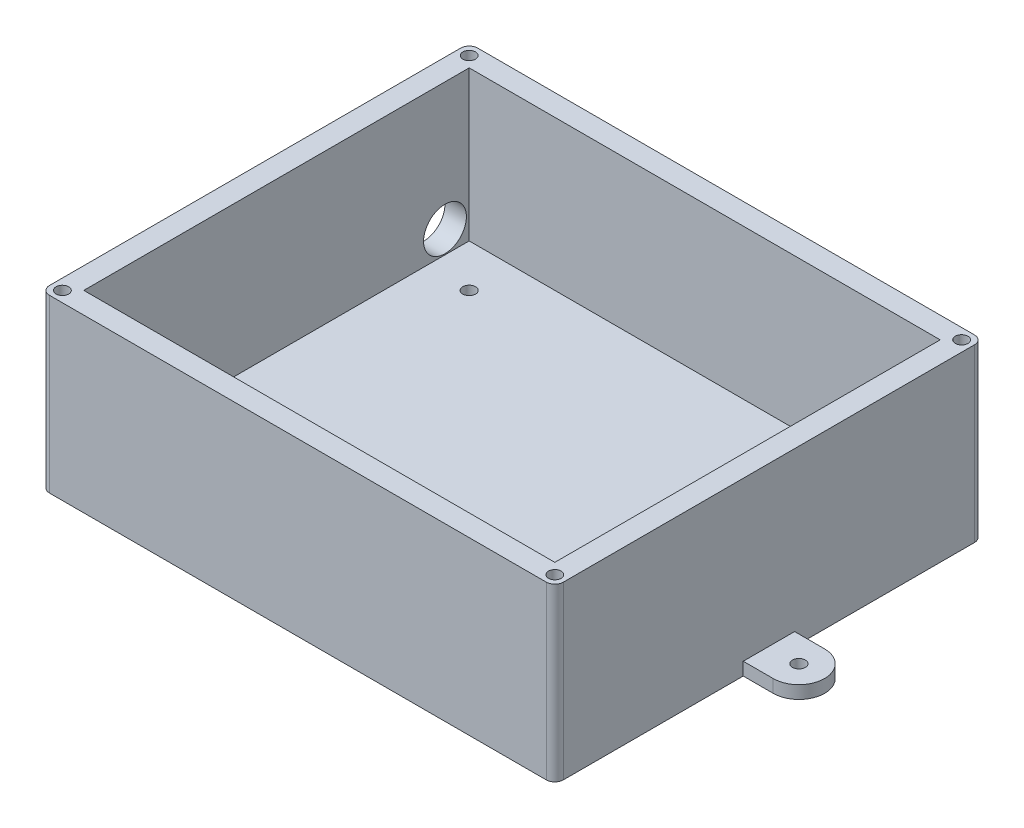
ISO-10303-21;
HEADER;
FILE_DESCRIPTION(('STEP AP214'),'2;1');
FILE_NAME('part.step','',(''),(''),'','','');
FILE_SCHEMA(('AUTOMOTIVE_DESIGN { 1 0 10303 214 1 1 1 1 }'));
ENDSEC;
DATA;
#1=APPLICATION_CONTEXT('core data for automotive mechanical design processes');
#2=APPLICATION_PROTOCOL_DEFINITION('international standard','automotive_design',2000,#1);
#3=PRODUCT_CONTEXT('',#1,'mechanical');
#4=PRODUCT('Part','Part','',(#3));
#5=PRODUCT_RELATED_PRODUCT_CATEGORY('part','',(#4));
#6=PRODUCT_DEFINITION_FORMATION('','',#4);
#7=PRODUCT_DEFINITION_CONTEXT('part definition',#1,'design');
#8=PRODUCT_DEFINITION('design','',#6,#7);
#9=PRODUCT_DEFINITION_SHAPE('','',#8);
#10=(LENGTH_UNIT() NAMED_UNIT(*) SI_UNIT(.MILLI.,.METRE.));
#11=(NAMED_UNIT(*) PLANE_ANGLE_UNIT() SI_UNIT($,.RADIAN.));
#12=(NAMED_UNIT(*) SI_UNIT($,.STERADIAN.) SOLID_ANGLE_UNIT());
#13=UNCERTAINTY_MEASURE_WITH_UNIT(LENGTH_MEASURE(1.E-05),#10,'distance_accuracy_value','');
#14=(GEOMETRIC_REPRESENTATION_CONTEXT(3) GLOBAL_UNCERTAINTY_ASSIGNED_CONTEXT((#13)) GLOBAL_UNIT_ASSIGNED_CONTEXT((#10,
#11,#12)) REPRESENTATION_CONTEXT('',''));
#15=CARTESIAN_POINT('',(0.,0.,0.));
#16=DIRECTION('',(0.,0.,1.));
#17=DIRECTION('',(1.,0.,0.));
#18=AXIS2_PLACEMENT_3D('',#15,#16,#17);
#19=CARTESIAN_POINT('',(-60.,40.,-50.));
#20=DIRECTION('',(1.,0.,0.));
#21=DIRECTION('',(0.,0.,-1.));
#22=AXIS2_PLACEMENT_3D('',#19,#20,#21);
#23=PLANE('',#22);
#24=CARTESIAN_POINT('',(-60.,10.2494679037175,-39.3490870790056));
#25=DIRECTION('',(-1.,0.,0.));
#26=DIRECTION('',(0.,0.,1.));
#27=AXIS2_PLACEMENT_3D('',#24,#25,#26);
#28=CIRCLE('',#27,5.);
#29=CARTESIAN_POINT('',(-60.,10.2494679037175,-34.3490870790056));
#30=VERTEX_POINT('',#29);
#31=EDGE_CURVE('E845',#30,#30,#28,.T.);
#32=ORIENTED_EDGE('',*,*,#31,.F.);
#33=EDGE_LOOP('',(#32));
#34=FACE_BOUND('',#33,.T.);
#35=DIRECTION('',(0.,0.,1.));
#36=VECTOR('',#35,1.);
#37=CARTESIAN_POINT('',(-60.,0.,-50.));
#38=LINE('',#37,#36);
#39=CARTESIAN_POINT('',(-60.,0.,6.00000000000003));
#40=VERTEX_POINT('',#39);
#41=CARTESIAN_POINT('',(-60.,0.,48.));
#42=VERTEX_POINT('',#41);
#43=EDGE_CURVE('E378',#40,#42,#38,.T.);
#44=ORIENTED_EDGE('',*,*,#43,.T.);
#45=DIRECTION('',(0.,-1.,0.));
#46=VECTOR('',#45,1.);
#47=CARTESIAN_POINT('',(-60.,40.,48.));
#48=LINE('',#47,#46);
#49=CARTESIAN_POINT('',(-60.,40.,48.));
#50=VERTEX_POINT('',#49);
#51=EDGE_CURVE('E11',#42,#50,#48,.F.);
#52=ORIENTED_EDGE('',*,*,#51,.T.);
#53=DIRECTION('',(0.,0.,1.));
#54=VECTOR('',#53,1.);
#55=CARTESIAN_POINT('',(-60.,40.,-50.));
#56=LINE('',#55,#54);
#57=CARTESIAN_POINT('',(-60.,40.,-48.));
#58=VERTEX_POINT('',#57);
#59=EDGE_CURVE('E363',#58,#50,#56,.T.);
#60=ORIENTED_EDGE('',*,*,#59,.F.);
#61=DIRECTION('',(0.,-1.,0.));
#62=VECTOR('',#61,1.);
#63=CARTESIAN_POINT('',(-60.,40.,-48.));
#64=LINE('',#63,#62);
#65=CARTESIAN_POINT('',(-60.,0.,-48.));
#66=VERTEX_POINT('',#65);
#67=EDGE_CURVE('E47',#58,#66,#64,.T.);
#68=ORIENTED_EDGE('',*,*,#67,.T.);
#69=CARTESIAN_POINT('',(-60.,0.,-5.99999999999997));
#70=VERTEX_POINT('',#69);
#71=EDGE_CURVE('E379',#66,#70,#38,.T.);
#72=ORIENTED_EDGE('',*,*,#71,.T.);
#73=DIRECTION('',(0.,-1.,0.));
#74=VECTOR('',#73,1.);
#75=CARTESIAN_POINT('',(-60.,3.,-5.99999999999997));
#76=LINE('',#75,#74);
#77=CARTESIAN_POINT('',(-60.,3.,-5.99999999999997));
#78=VERTEX_POINT('',#77);
#79=EDGE_CURVE('E225',#78,#70,#76,.T.);
#80=ORIENTED_EDGE('',*,*,#79,.F.);
#81=DIRECTION('',(0.,0.,1.));
#82=VECTOR('',#81,1.);
#83=CARTESIAN_POINT('',(-60.,3.,6.00000000000003));
#84=LINE('',#83,#82);
#85=CARTESIAN_POINT('',(-60.,3.,6.00000000000003));
#86=VERTEX_POINT('',#85);
#87=EDGE_CURVE('E187',#78,#86,#84,.T.);
#88=ORIENTED_EDGE('',*,*,#87,.T.);
#89=DIRECTION('',(0.,-1.,0.));
#90=VECTOR('',#89,1.);
#91=CARTESIAN_POINT('',(-60.,3.,6.00000000000003));
#92=LINE('',#91,#90);
#93=EDGE_CURVE('E201',#86,#40,#92,.T.);
#94=ORIENTED_EDGE('',*,*,#93,.T.);
#95=EDGE_LOOP('',(#44,#52,#60,#68,#72,#80,#88,#94));
#96=FACE_BOUND('',#95,.T.);
#97=ADVANCED_FACE('F38',(#34,#96),#23,.F.);
#98=CARTESIAN_POINT('',(60.,40.,-50.));
#99=DIRECTION('',(-1.,0.,0.));
#100=DIRECTION('',(0.,0.,1.));
#101=AXIS2_PLACEMENT_3D('',#98,#99,#100);
#102=PLANE('',#101);
#103=DIRECTION('',(0.,0.,-1.));
#104=VECTOR('',#103,1.);
#105=CARTESIAN_POINT('',(60.,40.,-50.));
#106=LINE('',#105,#104);
#107=CARTESIAN_POINT('',(60.,40.,48.));
#108=VERTEX_POINT('',#107);
#109=CARTESIAN_POINT('',(60.,40.,-48.));
#110=VERTEX_POINT('',#109);
#111=EDGE_CURVE('E355',#108,#110,#106,.T.);
#112=ORIENTED_EDGE('',*,*,#111,.F.);
#113=DIRECTION('',(0.,-1.,0.));
#114=VECTOR('',#113,1.);
#115=CARTESIAN_POINT('',(60.,40.,48.));
#116=LINE('',#115,#114);
#117=CARTESIAN_POINT('',(60.,0.,48.));
#118=VERTEX_POINT('',#117);
#119=EDGE_CURVE('E387',#108,#118,#116,.T.);
#120=ORIENTED_EDGE('',*,*,#119,.T.);
#121=DIRECTION('',(0.,0.,-1.));
#122=VECTOR('',#121,1.);
#123=CARTESIAN_POINT('',(60.,0.,-50.));
#124=LINE('',#123,#122);
#125=CARTESIAN_POINT('',(60.,0.,6.));
#126=VERTEX_POINT('',#125);
#127=EDGE_CURVE('E371',#118,#126,#124,.T.);
#128=ORIENTED_EDGE('',*,*,#127,.T.);
#129=DIRECTION('',(0.,-1.,0.));
#130=VECTOR('',#129,1.);
#131=CARTESIAN_POINT('',(60.,3.,6.));
#132=LINE('',#131,#130);
#133=CARTESIAN_POINT('',(60.,3.,6.));
#134=VERTEX_POINT('',#133);
#135=EDGE_CURVE('E267',#134,#126,#132,.T.);
#136=ORIENTED_EDGE('',*,*,#135,.F.);
#137=DIRECTION('',(0.,0.,-1.));
#138=VECTOR('',#137,1.);
#139=CARTESIAN_POINT('',(60.,3.,6.));
#140=LINE('',#139,#138);
#141=CARTESIAN_POINT('',(60.,3.,-6.));
#142=VERTEX_POINT('',#141);
#143=EDGE_CURVE('E239',#134,#142,#140,.T.);
#144=ORIENTED_EDGE('',*,*,#143,.T.);
#145=DIRECTION('',(0.,-1.,0.));
#146=VECTOR('',#145,1.);
#147=CARTESIAN_POINT('',(60.,3.,-6.));
#148=LINE('',#147,#146);
#149=CARTESIAN_POINT('',(60.,0.,-6.));
#150=VERTEX_POINT('',#149);
#151=EDGE_CURVE('E256',#142,#150,#148,.T.);
#152=ORIENTED_EDGE('',*,*,#151,.T.);
#153=CARTESIAN_POINT('',(60.,0.,-48.));
#154=VERTEX_POINT('',#153);
#155=EDGE_CURVE('E321',#150,#154,#124,.T.);
#156=ORIENTED_EDGE('',*,*,#155,.T.);
#157=DIRECTION('',(0.,-1.,0.));
#158=VECTOR('',#157,1.);
#159=CARTESIAN_POINT('',(60.,40.,-48.));
#160=LINE('',#159,#158);
#161=EDGE_CURVE('E370',#154,#110,#160,.F.);
#162=ORIENTED_EDGE('',*,*,#161,.T.);
#163=EDGE_LOOP('',(#112,#120,#128,#136,#144,#152,#156,#162));
#164=FACE_BOUND('',#163,.T.);
#165=ADVANCED_FACE('F450',(#164),#102,.F.);
#166=CARTESIAN_POINT('',(-60.,40.,-50.));
#167=DIRECTION('',(0.,0.,1.));
#168=DIRECTION('',(1.,0.,0.));
#169=AXIS2_PLACEMENT_3D('',#166,#167,#168);
#170=PLANE('',#169);
#171=DIRECTION('',(-1.,0.,0.));
#172=VECTOR('',#171,1.);
#173=CARTESIAN_POINT('',(-60.,40.,-50.));
#174=LINE('',#173,#172);
#175=CARTESIAN_POINT('',(58.,40.,-50.));
#176=VERTEX_POINT('',#175);
#177=CARTESIAN_POINT('',(-58.,40.,-50.));
#178=VERTEX_POINT('',#177);
#179=EDGE_CURVE('E359',#176,#178,#174,.T.);
#180=ORIENTED_EDGE('',*,*,#179,.F.);
#181=DIRECTION('',(0.,-1.,0.));
#182=VECTOR('',#181,1.);
#183=CARTESIAN_POINT('',(58.,40.,-50.));
#184=LINE('',#183,#182);
#185=CARTESIAN_POINT('',(58.,0.,-50.));
#186=VERTEX_POINT('',#185);
#187=EDGE_CURVE('E424',#176,#186,#184,.T.);
#188=ORIENTED_EDGE('',*,*,#187,.T.);
#189=DIRECTION('',(-1.,0.,0.));
#190=VECTOR('',#189,1.);
#191=CARTESIAN_POINT('',(-60.,0.,-50.));
#192=LINE('',#191,#190);
#193=CARTESIAN_POINT('',(-58.,0.,-50.));
#194=VERTEX_POINT('',#193);
#195=EDGE_CURVE('E374',#186,#194,#192,.T.);
#196=ORIENTED_EDGE('',*,*,#195,.T.);
#197=DIRECTION('',(0.,-1.,0.));
#198=VECTOR('',#197,1.);
#199=CARTESIAN_POINT('',(-58.,40.,-50.));
#200=LINE('',#199,#198);
#201=EDGE_CURVE('E421',#194,#178,#200,.F.);
#202=ORIENTED_EDGE('',*,*,#201,.T.);
#203=EDGE_LOOP('',(#180,#188,#196,#202));
#204=FACE_BOUND('',#203,.T.);
#205=ADVANCED_FACE('F458',(#204),#170,.F.);
#206=CARTESIAN_POINT('',(-60.,40.,50.));
#207=DIRECTION('',(0.,0.,-1.));
#208=DIRECTION('',(-1.,0.,0.));
#209=AXIS2_PLACEMENT_3D('',#206,#207,#208);
#210=PLANE('',#209);
#211=DIRECTION('',(1.,0.,0.));
#212=VECTOR('',#211,1.);
#213=CARTESIAN_POINT('',(-60.,0.,50.));
#214=LINE('',#213,#212);
#215=CARTESIAN_POINT('',(-58.,0.,50.));
#216=VERTEX_POINT('',#215);
#217=CARTESIAN_POINT('',(58.,0.,50.));
#218=VERTEX_POINT('',#217);
#219=EDGE_CURVE('E360',#216,#218,#214,.T.);
#220=ORIENTED_EDGE('',*,*,#219,.T.);
#221=DIRECTION('',(0.,-1.,0.));
#222=VECTOR('',#221,1.);
#223=CARTESIAN_POINT('',(58.,40.,50.));
#224=LINE('',#223,#222);
#225=CARTESIAN_POINT('',(58.,40.,50.));
#226=VERTEX_POINT('',#225);
#227=EDGE_CURVE('E407',#218,#226,#224,.F.);
#228=ORIENTED_EDGE('',*,*,#227,.T.);
#229=DIRECTION('',(1.,0.,0.));
#230=VECTOR('',#229,1.);
#231=CARTESIAN_POINT('',(-60.,40.,50.));
#232=LINE('',#231,#230);
#233=CARTESIAN_POINT('',(-58.,40.,50.));
#234=VERTEX_POINT('',#233);
#235=EDGE_CURVE('E366',#234,#226,#232,.T.);
#236=ORIENTED_EDGE('',*,*,#235,.F.);
#237=DIRECTION('',(0.,-1.,0.));
#238=VECTOR('',#237,1.);
#239=CARTESIAN_POINT('',(-58.,40.,50.));
#240=LINE('',#239,#238);
#241=EDGE_CURVE('E403',#234,#216,#240,.T.);
#242=ORIENTED_EDGE('',*,*,#241,.T.);
#243=EDGE_LOOP('',(#220,#228,#236,#242));
#244=FACE_BOUND('',#243,.T.);
#245=ADVANCED_FACE('F477',(#244),#210,.F.);
#246=CARTESIAN_POINT('',(0.,40.,0.));
#247=DIRECTION('',(0.,1.,0.));
#248=DIRECTION('',(0.,0.,1.));
#249=AXIS2_PLACEMENT_3D('',#246,#247,#248);
#250=PLANE('',#249);
#251=CARTESIAN_POINT('',(-57.5,40.,47.5));
#252=DIRECTION('',(0.,-1.,0.));
#253=DIRECTION('',(0.,0.,-1.));
#254=AXIS2_PLACEMENT_3D('',#251,#252,#253);
#255=CIRCLE('',#254,1.475);
#256=CARTESIAN_POINT('',(-57.5,40.,46.025));
#257=VERTEX_POINT('',#256);
#258=EDGE_CURVE('E812',#257,#257,#255,.T.);
#259=ORIENTED_EDGE('',*,*,#258,.T.);
#260=EDGE_LOOP('',(#259));
#261=FACE_BOUND('',#260,.T.);
#262=CARTESIAN_POINT('',(57.5,40.,47.5));
#263=DIRECTION('',(0.,1.,0.));
#264=DIRECTION('',(0.,0.,-1.));
#265=AXIS2_PLACEMENT_3D('',#262,#263,#264);
#266=CIRCLE('',#265,1.475);
#267=CARTESIAN_POINT('',(57.5,40.,46.025));
#268=VERTEX_POINT('',#267);
#269=EDGE_CURVE('E816',#268,#268,#266,.T.);
#270=ORIENTED_EDGE('',*,*,#269,.F.);
#271=EDGE_LOOP('',(#270));
#272=FACE_BOUND('',#271,.T.);
#273=CARTESIAN_POINT('',(57.5,40.,-47.5));
#274=DIRECTION('',(0.,-1.,0.));
#275=DIRECTION('',(0.,0.,1.));
#276=AXIS2_PLACEMENT_3D('',#273,#274,#275);
#277=CIRCLE('',#276,1.475);
#278=CARTESIAN_POINT('',(57.5,40.,-46.025));
#279=VERTEX_POINT('',#278);
#280=EDGE_CURVE('E820',#279,#279,#277,.T.);
#281=ORIENTED_EDGE('',*,*,#280,.T.);
#282=EDGE_LOOP('',(#281));
#283=FACE_BOUND('',#282,.T.);
#284=CARTESIAN_POINT('',(-57.5,40.,-47.5));
#285=DIRECTION('',(0.,1.,0.));
#286=DIRECTION('',(0.,0.,1.));
#287=AXIS2_PLACEMENT_3D('',#284,#285,#286);
#288=CIRCLE('',#287,1.475);
#289=CARTESIAN_POINT('',(-57.5,40.,-46.025));
#290=VERTEX_POINT('',#289);
#291=EDGE_CURVE('E824',#290,#290,#288,.T.);
#292=ORIENTED_EDGE('',*,*,#291,.F.);
#293=EDGE_LOOP('',(#292));
#294=FACE_BOUND('',#293,.T.);
#295=DIRECTION('',(0.,0.,-1.));
#296=VECTOR('',#295,1.);
#297=CARTESIAN_POINT('',(55.,40.,-50.));
#298=LINE('',#297,#296);
#299=CARTESIAN_POINT('',(55.,40.,45.));
#300=VERTEX_POINT('',#299);
#301=CARTESIAN_POINT('',(55.,40.,-45.));
#302=VERTEX_POINT('',#301);
#303=EDGE_CURVE('E343',#300,#302,#298,.T.);
#304=ORIENTED_EDGE('',*,*,#303,.F.);
#305=DIRECTION('',(1.,0.,0.));
#306=VECTOR('',#305,1.);
#307=CARTESIAN_POINT('',(-60.,40.,45.));
#308=LINE('',#307,#306);
#309=CARTESIAN_POINT('',(-55.,40.,45.));
#310=VERTEX_POINT('',#309);
#311=EDGE_CURVE('E328',#310,#300,#308,.T.);
#312=ORIENTED_EDGE('',*,*,#311,.F.);
#313=DIRECTION('',(0.,0.,1.));
#314=VECTOR('',#313,1.);
#315=CARTESIAN_POINT('',(-55.,40.,-50.));
#316=LINE('',#315,#314);
#317=CARTESIAN_POINT('',(-55.,40.,-45.));
#318=VERTEX_POINT('',#317);
#319=EDGE_CURVE('E349',#318,#310,#316,.T.);
#320=ORIENTED_EDGE('',*,*,#319,.F.);
#321=DIRECTION('',(-1.,0.,0.));
#322=VECTOR('',#321,1.);
#323=CARTESIAN_POINT('',(-60.,40.,-45.));
#324=LINE('',#323,#322);
#325=EDGE_CURVE('E346',#302,#318,#324,.T.);
#326=ORIENTED_EDGE('',*,*,#325,.F.);
#327=EDGE_LOOP('',(#304,#312,#320,#326));
#328=FACE_BOUND('',#327,.T.);
#329=ORIENTED_EDGE('',*,*,#235,.T.);
#330=CARTESIAN_POINT('',(58.,40.,48.));
#331=DIRECTION('',(0.,1.,0.));
#332=DIRECTION('',(0.,0.,1.));
#333=AXIS2_PLACEMENT_3D('',#330,#331,#332);
#334=CIRCLE('',#333,2.);
#335=EDGE_CURVE('E418',#226,#108,#334,.T.);
#336=ORIENTED_EDGE('',*,*,#335,.T.);
#337=ORIENTED_EDGE('',*,*,#111,.T.);
#338=CARTESIAN_POINT('',(58.,40.,-48.));
#339=DIRECTION('',(0.,1.,0.));
#340=DIRECTION('',(0.,0.,1.));
#341=AXIS2_PLACEMENT_3D('',#338,#339,#340);
#342=CIRCLE('',#341,2.);
#343=EDGE_CURVE('E415',#110,#176,#342,.T.);
#344=ORIENTED_EDGE('',*,*,#343,.T.);
#345=ORIENTED_EDGE('',*,*,#179,.T.);
#346=CARTESIAN_POINT('',(-58.,40.,-48.));
#347=DIRECTION('',(0.,1.,0.));
#348=DIRECTION('',(0.,0.,1.));
#349=AXIS2_PLACEMENT_3D('',#346,#347,#348);
#350=CIRCLE('',#349,2.);
#351=EDGE_CURVE('E59',#178,#58,#350,.T.);
#352=ORIENTED_EDGE('',*,*,#351,.T.);
#353=ORIENTED_EDGE('',*,*,#59,.T.);
#354=CARTESIAN_POINT('',(-58.,40.,48.));
#355=DIRECTION('',(0.,1.,0.));
#356=DIRECTION('',(0.,0.,1.));
#357=AXIS2_PLACEMENT_3D('',#354,#355,#356);
#358=CIRCLE('',#357,2.);
#359=EDGE_CURVE('E412',#50,#234,#358,.T.);
#360=ORIENTED_EDGE('',*,*,#359,.T.);
#361=EDGE_LOOP('',(#329,#336,#337,#344,#345,#352,#353,#360));
#362=FACE_BOUND('',#361,.T.);
#363=ADVANCED_FACE('F456',(#261,#272,#283,#294,#328,#362),#250,.T.);
#364=CARTESIAN_POINT('',(0.,0.,0.));
#365=DIRECTION('',(0.,1.,0.));
#366=DIRECTION('',(0.,0.,1.));
#367=AXIS2_PLACEMENT_3D('',#364,#365,#366);
#368=PLANE('',#367);
#369=CARTESIAN_POINT('',(-45.,0.,35.));
#370=DIRECTION('',(0.,1.,0.));
#371=DIRECTION('',(0.,0.,-1.));
#372=AXIS2_PLACEMENT_3D('',#369,#370,#371);
#373=CIRCLE('',#372,1.5);
#374=CARTESIAN_POINT('',(-45.,0.,33.5));
#375=VERTEX_POINT('',#374);
#376=EDGE_CURVE('E298',#375,#375,#373,.T.);
#377=ORIENTED_EDGE('',*,*,#376,.T.);
#378=EDGE_LOOP('',(#377));
#379=FACE_BOUND('',#378,.T.);
#380=CARTESIAN_POINT('',(44.9999999999999,0.,35.));
#381=DIRECTION('',(0.,1.,0.));
#382=DIRECTION('',(0.,0.,1.));
#383=AXIS2_PLACEMENT_3D('',#380,#381,#382);
#384=CIRCLE('',#383,1.5);
#385=CARTESIAN_POINT('',(44.9999999999999,0.,36.5));
#386=VERTEX_POINT('',#385);
#387=EDGE_CURVE('E290',#386,#386,#384,.T.);
#388=ORIENTED_EDGE('',*,*,#387,.T.);
#389=EDGE_LOOP('',(#388));
#390=FACE_BOUND('',#389,.T.);
#391=CARTESIAN_POINT('',(45.,0.,-35.));
#392=DIRECTION('',(0.,1.,0.));
#393=DIRECTION('',(0.,0.,-1.));
#394=AXIS2_PLACEMENT_3D('',#391,#392,#393);
#395=CIRCLE('',#394,1.5);
#396=CARTESIAN_POINT('',(45.,0.,-36.5));
#397=VERTEX_POINT('',#396);
#398=EDGE_CURVE('E281',#397,#397,#395,.T.);
#399=ORIENTED_EDGE('',*,*,#398,.T.);
#400=EDGE_LOOP('',(#399));
#401=FACE_BOUND('',#400,.T.);
#402=CARTESIAN_POINT('',(-45.,0.,-35.));
#403=DIRECTION('',(0.,1.,0.));
#404=DIRECTION('',(0.,0.,1.));
#405=AXIS2_PLACEMENT_3D('',#402,#403,#404);
#406=CIRCLE('',#405,1.5);
#407=CARTESIAN_POINT('',(-45.,0.,-33.5));
#408=VERTEX_POINT('',#407);
#409=EDGE_CURVE('E305',#408,#408,#406,.T.);
#410=ORIENTED_EDGE('',*,*,#409,.T.);
#411=EDGE_LOOP('',(#410));
#412=FACE_BOUND('',#411,.T.);
#413=ORIENTED_EDGE('',*,*,#127,.F.);
#414=CARTESIAN_POINT('',(58.,0.,48.));
#415=DIRECTION('',(0.,1.,0.));
#416=DIRECTION('',(0.,0.,1.));
#417=AXIS2_PLACEMENT_3D('',#414,#415,#416);
#418=CIRCLE('',#417,2.);
#419=EDGE_CURVE('E400',#118,#218,#418,.F.);
#420=ORIENTED_EDGE('',*,*,#419,.T.);
#421=ORIENTED_EDGE('',*,*,#219,.F.);
#422=CARTESIAN_POINT('',(-58.,0.,48.));
#423=DIRECTION('',(0.,1.,0.));
#424=DIRECTION('',(0.,0.,1.));
#425=AXIS2_PLACEMENT_3D('',#422,#423,#424);
#426=CIRCLE('',#425,2.);
#427=EDGE_CURVE('E394',#216,#42,#426,.F.);
#428=ORIENTED_EDGE('',*,*,#427,.T.);
#429=ORIENTED_EDGE('',*,*,#43,.F.);
#430=DIRECTION('',(-1.,0.,0.));
#431=VECTOR('',#430,1.);
#432=CARTESIAN_POINT('',(-60.,0.,6.00000000000003));
#433=LINE('',#432,#431);
#434=CARTESIAN_POINT('',(-67.,0.,6.00000000000003));
#435=VERTEX_POINT('',#434);
#436=EDGE_CURVE('E216',#40,#435,#433,.T.);
#437=ORIENTED_EDGE('',*,*,#436,.T.);
#438=CARTESIAN_POINT('',(-67.,0.,0.));
#439=DIRECTION('',(0.,-1.,0.));
#440=DIRECTION('',(0.,0.,-1.));
#441=AXIS2_PLACEMENT_3D('',#438,#439,#440);
#442=CIRCLE('',#441,6.);
#443=CARTESIAN_POINT('',(-67.,0.,-5.99999999999997));
#444=VERTEX_POINT('',#443);
#445=EDGE_CURVE('E181',#435,#444,#442,.T.);
#446=ORIENTED_EDGE('',*,*,#445,.T.);
#447=DIRECTION('',(1.,0.,0.));
#448=VECTOR('',#447,1.);
#449=CARTESIAN_POINT('',(-60.,0.,-5.99999999999997));
#450=LINE('',#449,#448);
#451=EDGE_CURVE('E203',#444,#70,#450,.T.);
#452=ORIENTED_EDGE('',*,*,#451,.T.);
#453=ORIENTED_EDGE('',*,*,#71,.F.);
#454=CARTESIAN_POINT('',(-58.,0.,-48.));
#455=DIRECTION('',(0.,1.,0.));
#456=DIRECTION('',(0.,0.,1.));
#457=AXIS2_PLACEMENT_3D('',#454,#455,#456);
#458=CIRCLE('',#457,2.);
#459=EDGE_CURVE('E391',#66,#194,#458,.F.);
#460=ORIENTED_EDGE('',*,*,#459,.T.);
#461=ORIENTED_EDGE('',*,*,#195,.F.);
#462=CARTESIAN_POINT('',(58.,0.,-48.));
#463=DIRECTION('',(0.,1.,0.));
#464=DIRECTION('',(0.,0.,1.));
#465=AXIS2_PLACEMENT_3D('',#462,#463,#464);
#466=CIRCLE('',#465,2.);
#467=EDGE_CURVE('E397',#186,#154,#466,.F.);
#468=ORIENTED_EDGE('',*,*,#467,.T.);
#469=ORIENTED_EDGE('',*,*,#155,.F.);
#470=DIRECTION('',(1.,0.,0.));
#471=VECTOR('',#470,1.);
#472=CARTESIAN_POINT('',(60.,0.,-6.));
#473=LINE('',#472,#471);
#474=CARTESIAN_POINT('',(67.,0.,-6.));
#475=VERTEX_POINT('',#474);
#476=EDGE_CURVE('E235',#150,#475,#473,.T.);
#477=ORIENTED_EDGE('',*,*,#476,.T.);
#478=CARTESIAN_POINT('',(67.,0.,0.));
#479=DIRECTION('',(0.,-1.,0.));
#480=DIRECTION('',(0.,0.,1.));
#481=AXIS2_PLACEMENT_3D('',#478,#479,#480);
#482=CIRCLE('',#481,6.);
#483=CARTESIAN_POINT('',(67.,0.,6.));
#484=VERTEX_POINT('',#483);
#485=EDGE_CURVE('E260',#475,#484,#482,.T.);
#486=ORIENTED_EDGE('',*,*,#485,.T.);
#487=DIRECTION('',(-1.,0.,0.));
#488=VECTOR('',#487,1.);
#489=CARTESIAN_POINT('',(60.,0.,6.));
#490=LINE('',#489,#488);
#491=EDGE_CURVE('E244',#484,#126,#490,.T.);
#492=ORIENTED_EDGE('',*,*,#491,.T.);
#493=EDGE_LOOP('',(#413,#420,#421,#428,#429,#437,#446,#452,#453,#460,#461,#468,#469,#477,#486,#492));
#494=FACE_BOUND('',#493,.T.);
#495=CARTESIAN_POINT('',(67.,0.,0.));
#496=DIRECTION('',(0.,-1.,0.));
#497=DIRECTION('',(0.,0.,-1.));
#498=AXIS2_PLACEMENT_3D('',#495,#496,#497);
#499=CIRCLE('',#498,1.5);
#500=CARTESIAN_POINT('',(67.,0.,-1.5));
#501=VERTEX_POINT('',#500);
#502=EDGE_CURVE('E224',#501,#501,#499,.T.);
#503=ORIENTED_EDGE('',*,*,#502,.F.);
#504=EDGE_LOOP('',(#503));
#505=FACE_BOUND('',#504,.T.);
#506=CARTESIAN_POINT('',(-67.,0.,0.));
#507=DIRECTION('',(0.,-1.,0.));
#508=DIRECTION('',(0.,0.,1.));
#509=AXIS2_PLACEMENT_3D('',#506,#507,#508);
#510=CIRCLE('',#509,1.5);
#511=CARTESIAN_POINT('',(-67.,0.,1.50000000000003));
#512=VERTEX_POINT('',#511);
#513=EDGE_CURVE('E209',#512,#512,#510,.T.);
#514=ORIENTED_EDGE('',*,*,#513,.F.);
#515=EDGE_LOOP('',(#514));
#516=FACE_BOUND('',#515,.T.);
#517=ADVANCED_FACE('F435',(#379,#390,#401,#412,#494,#505,#516),#368,.F.);
#518=CARTESIAN_POINT('',(55.,40.,-50.));
#519=DIRECTION('',(-1.,0.,0.));
#520=DIRECTION('',(0.,0.,1.));
#521=AXIS2_PLACEMENT_3D('',#518,#519,#520);
#522=PLANE('',#521);
#523=DIRECTION('',(0.,0.,-1.));
#524=VECTOR('',#523,1.);
#525=CARTESIAN_POINT('',(55.,5.,-50.));
#526=LINE('',#525,#524);
#527=CARTESIAN_POINT('',(55.,5.,45.));
#528=VERTEX_POINT('',#527);
#529=CARTESIAN_POINT('',(55.,5.,-45.));
#530=VERTEX_POINT('',#529);
#531=EDGE_CURVE('E309',#528,#530,#526,.T.);
#532=ORIENTED_EDGE('',*,*,#531,.F.);
#533=DIRECTION('',(0.,-1.,0.));
#534=VECTOR('',#533,1.);
#535=CARTESIAN_POINT('',(55.,40.,45.));
#536=LINE('',#535,#534);
#537=EDGE_CURVE('E323',#300,#528,#536,.T.);
#538=ORIENTED_EDGE('',*,*,#537,.F.);
#539=ORIENTED_EDGE('',*,*,#303,.T.);
#540=DIRECTION('',(0.,-1.,0.));
#541=VECTOR('',#540,1.);
#542=CARTESIAN_POINT('',(55.,40.,-45.));
#543=LINE('',#542,#541);
#544=EDGE_CURVE('E317',#302,#530,#543,.T.);
#545=ORIENTED_EDGE('',*,*,#544,.T.);
#546=EDGE_LOOP('',(#532,#538,#539,#545));
#547=FACE_BOUND('',#546,.T.);
#548=ADVANCED_FACE('F680',(#547),#522,.T.);
#549=CARTESIAN_POINT('',(-60.,40.,-45.));
#550=DIRECTION('',(0.,0.,1.));
#551=DIRECTION('',(1.,0.,0.));
#552=AXIS2_PLACEMENT_3D('',#549,#550,#551);
#553=PLANE('',#552);
#554=DIRECTION('',(-1.,0.,0.));
#555=VECTOR('',#554,1.);
#556=CARTESIAN_POINT('',(-60.,5.,-45.));
#557=LINE('',#556,#555);
#558=CARTESIAN_POINT('',(-55.,5.,-45.));
#559=VERTEX_POINT('',#558);
#560=EDGE_CURVE('E316',#530,#559,#557,.T.);
#561=ORIENTED_EDGE('',*,*,#560,.F.);
#562=ORIENTED_EDGE('',*,*,#544,.F.);
#563=ORIENTED_EDGE('',*,*,#325,.T.);
#564=DIRECTION('',(0.,-1.,0.));
#565=VECTOR('',#564,1.);
#566=CARTESIAN_POINT('',(-55.,40.,-45.));
#567=LINE('',#566,#565);
#568=EDGE_CURVE('E322',#318,#559,#567,.T.);
#569=ORIENTED_EDGE('',*,*,#568,.T.);
#570=EDGE_LOOP('',(#561,#562,#563,#569));
#571=FACE_BOUND('',#570,.T.);
#572=ADVANCED_FACE('F697',(#571),#553,.T.);
#573=CARTESIAN_POINT('',(-55.,40.,-50.));
#574=DIRECTION('',(1.,0.,0.));
#575=DIRECTION('',(0.,0.,-1.));
#576=AXIS2_PLACEMENT_3D('',#573,#574,#575);
#577=PLANE('',#576);
#578=CARTESIAN_POINT('',(-55.,10.2494679037175,-39.3490870790056));
#579=DIRECTION('',(1.,0.,0.));
#580=DIRECTION('',(0.,0.,-1.));
#581=AXIS2_PLACEMENT_3D('',#578,#579,#580);
#582=CIRCLE('',#581,5.);
#583=CARTESIAN_POINT('',(-55.,10.2494679037175,-44.3490870790056));
#584=VERTEX_POINT('',#583);
#585=EDGE_CURVE('E854',#584,#584,#582,.F.);
#586=ORIENTED_EDGE('',*,*,#585,.T.);
#587=EDGE_LOOP('',(#586));
#588=FACE_BOUND('',#587,.T.);
#589=DIRECTION('',(0.,0.,1.));
#590=VECTOR('',#589,1.);
#591=CARTESIAN_POINT('',(-55.,5.,-50.));
#592=LINE('',#591,#590);
#593=CARTESIAN_POINT('',(-55.,5.,45.));
#594=VERTEX_POINT('',#593);
#595=EDGE_CURVE('E331',#559,#594,#592,.T.);
#596=ORIENTED_EDGE('',*,*,#595,.F.);
#597=ORIENTED_EDGE('',*,*,#568,.F.);
#598=ORIENTED_EDGE('',*,*,#319,.T.);
#599=DIRECTION('',(0.,-1.,0.));
#600=VECTOR('',#599,1.);
#601=CARTESIAN_POINT('',(-55.,40.,45.));
#602=LINE('',#601,#600);
#603=EDGE_CURVE('E327',#310,#594,#602,.T.);
#604=ORIENTED_EDGE('',*,*,#603,.T.);
#605=EDGE_LOOP('',(#596,#597,#598,#604));
#606=FACE_BOUND('',#605,.T.);
#607=ADVANCED_FACE('F705',(#588,#606),#577,.T.);
#608=CARTESIAN_POINT('',(-60.,40.,45.));
#609=DIRECTION('',(0.,0.,-1.));
#610=DIRECTION('',(-1.,0.,0.));
#611=AXIS2_PLACEMENT_3D('',#608,#609,#610);
#612=PLANE('',#611);
#613=DIRECTION('',(1.,0.,0.));
#614=VECTOR('',#613,1.);
#615=CARTESIAN_POINT('',(-60.,5.,45.));
#616=LINE('',#615,#614);
#617=EDGE_CURVE('E337',#594,#528,#616,.T.);
#618=ORIENTED_EDGE('',*,*,#617,.F.);
#619=ORIENTED_EDGE('',*,*,#603,.F.);
#620=ORIENTED_EDGE('',*,*,#311,.T.);
#621=ORIENTED_EDGE('',*,*,#537,.T.);
#622=EDGE_LOOP('',(#618,#619,#620,#621));
#623=FACE_BOUND('',#622,.T.);
#624=ADVANCED_FACE('F713',(#623),#612,.T.);
#625=CARTESIAN_POINT('',(0.,5.,0.));
#626=DIRECTION('',(0.,1.,0.));
#627=DIRECTION('',(0.,0.,1.));
#628=AXIS2_PLACEMENT_3D('',#625,#626,#627);
#629=PLANE('',#628);
#630=CARTESIAN_POINT('',(-45.,5.,35.));
#631=DIRECTION('',(0.,1.,0.));
#632=DIRECTION('',(0.,0.,-1.));
#633=AXIS2_PLACEMENT_3D('',#630,#631,#632);
#634=CIRCLE('',#633,1.5);
#635=CARTESIAN_POINT('',(-45.,5.,33.5));
#636=VERTEX_POINT('',#635);
#637=EDGE_CURVE('E271',#636,#636,#634,.T.);
#638=ORIENTED_EDGE('',*,*,#637,.F.);
#639=EDGE_LOOP('',(#638));
#640=FACE_BOUND('',#639,.T.);
#641=CARTESIAN_POINT('',(44.9999999999999,5.,35.));
#642=DIRECTION('',(0.,1.,0.));
#643=DIRECTION('',(0.,0.,1.));
#644=AXIS2_PLACEMENT_3D('',#641,#642,#643);
#645=CIRCLE('',#644,1.5);
#646=CARTESIAN_POINT('',(44.9999999999999,5.,36.5));
#647=VERTEX_POINT('',#646);
#648=EDGE_CURVE('E294',#647,#647,#645,.T.);
#649=ORIENTED_EDGE('',*,*,#648,.F.);
#650=EDGE_LOOP('',(#649));
#651=FACE_BOUND('',#650,.T.);
#652=CARTESIAN_POINT('',(45.,5.,-35.));
#653=DIRECTION('',(0.,1.,0.));
#654=DIRECTION('',(0.,0.,-1.));
#655=AXIS2_PLACEMENT_3D('',#652,#653,#654);
#656=CIRCLE('',#655,1.5);
#657=CARTESIAN_POINT('',(45.,5.,-36.5));
#658=VERTEX_POINT('',#657);
#659=EDGE_CURVE('E286',#658,#658,#656,.T.);
#660=ORIENTED_EDGE('',*,*,#659,.F.);
#661=EDGE_LOOP('',(#660));
#662=FACE_BOUND('',#661,.T.);
#663=CARTESIAN_POINT('',(-45.,5.,-35.));
#664=DIRECTION('',(0.,1.,0.));
#665=DIRECTION('',(0.,0.,1.));
#666=AXIS2_PLACEMENT_3D('',#663,#664,#665);
#667=CIRCLE('',#666,1.5);
#668=CARTESIAN_POINT('',(-45.,5.,-33.5));
#669=VERTEX_POINT('',#668);
#670=EDGE_CURVE('E285',#669,#669,#667,.T.);
#671=ORIENTED_EDGE('',*,*,#670,.F.);
#672=EDGE_LOOP('',(#671));
#673=FACE_BOUND('',#672,.T.);
#674=ORIENTED_EDGE('',*,*,#531,.T.);
#675=ORIENTED_EDGE('',*,*,#560,.T.);
#676=ORIENTED_EDGE('',*,*,#595,.T.);
#677=ORIENTED_EDGE('',*,*,#617,.T.);
#678=EDGE_LOOP('',(#674,#675,#676,#677));
#679=FACE_BOUND('',#678,.T.);
#680=ADVANCED_FACE('F720',(#640,#651,#662,#673,#679),#629,.T.);
#681=CARTESIAN_POINT('',(-45.,0.,-35.));
#682=DIRECTION('',(0.,1.,0.));
#683=DIRECTION('',(0.,0.,1.));
#684=AXIS2_PLACEMENT_3D('',#681,#682,#683);
#685=CYLINDRICAL_SURFACE('',#684,1.5);
#686=ORIENTED_EDGE('',*,*,#409,.F.);
#687=EDGE_LOOP('',(#686));
#688=FACE_BOUND('',#687,.T.);
#689=ORIENTED_EDGE('',*,*,#670,.T.);
#690=EDGE_LOOP('',(#689));
#691=FACE_BOUND('',#690,.T.);
#692=ADVANCED_FACE('F728',(#688,#691),#685,.F.);
#693=CARTESIAN_POINT('',(45.,0.,-35.));
#694=DIRECTION('',(0.,1.,0.));
#695=DIRECTION('',(0.,0.,1.));
#696=AXIS2_PLACEMENT_3D('',#693,#694,#695);
#697=CYLINDRICAL_SURFACE('',#696,1.5);
#698=ORIENTED_EDGE('',*,*,#398,.F.);
#699=EDGE_LOOP('',(#698));
#700=FACE_BOUND('',#699,.T.);
#701=ORIENTED_EDGE('',*,*,#659,.T.);
#702=EDGE_LOOP('',(#701));
#703=FACE_BOUND('',#702,.T.);
#704=ADVANCED_FACE('F736',(#700,#703),#697,.F.);
#705=CARTESIAN_POINT('',(44.9999999999999,0.,35.));
#706=DIRECTION('',(0.,1.,0.));
#707=DIRECTION('',(0.,0.,1.));
#708=AXIS2_PLACEMENT_3D('',#705,#706,#707);
#709=CYLINDRICAL_SURFACE('',#708,1.5);
#710=ORIENTED_EDGE('',*,*,#387,.F.);
#711=EDGE_LOOP('',(#710));
#712=FACE_BOUND('',#711,.T.);
#713=ORIENTED_EDGE('',*,*,#648,.T.);
#714=EDGE_LOOP('',(#713));
#715=FACE_BOUND('',#714,.T.);
#716=ADVANCED_FACE('F744',(#712,#715),#709,.F.);
#717=CARTESIAN_POINT('',(-45.,0.,35.));
#718=DIRECTION('',(0.,1.,0.));
#719=DIRECTION('',(0.,0.,1.));
#720=AXIS2_PLACEMENT_3D('',#717,#718,#719);
#721=CYLINDRICAL_SURFACE('',#720,1.5);
#722=ORIENTED_EDGE('',*,*,#376,.F.);
#723=EDGE_LOOP('',(#722));
#724=FACE_BOUND('',#723,.T.);
#725=ORIENTED_EDGE('',*,*,#637,.T.);
#726=EDGE_LOOP('',(#725));
#727=FACE_BOUND('',#726,.T.);
#728=ADVANCED_FACE('F671',(#724,#727),#721,.F.);
#729=CARTESIAN_POINT('',(60.,3.,6.));
#730=DIRECTION('',(0.,0.,1.));
#731=DIRECTION('',(1.,0.,0.));
#732=AXIS2_PLACEMENT_3D('',#729,#730,#731);
#733=PLANE('',#732);
#734=ORIENTED_EDGE('',*,*,#491,.F.);
#735=DIRECTION('',(0.,-1.,0.));
#736=VECTOR('',#735,1.);
#737=CARTESIAN_POINT('',(67.,3.,6.));
#738=LINE('',#737,#736);
#739=CARTESIAN_POINT('',(67.,3.,6.));
#740=VERTEX_POINT('',#739);
#741=EDGE_CURVE('E272',#740,#484,#738,.T.);
#742=ORIENTED_EDGE('',*,*,#741,.F.);
#743=DIRECTION('',(-1.,0.,0.));
#744=VECTOR('',#743,1.);
#745=CARTESIAN_POINT('',(60.,3.,6.));
#746=LINE('',#745,#744);
#747=EDGE_CURVE('E252',#740,#134,#746,.T.);
#748=ORIENTED_EDGE('',*,*,#747,.T.);
#749=ORIENTED_EDGE('',*,*,#135,.T.);
#750=EDGE_LOOP('',(#734,#742,#748,#749));
#751=FACE_BOUND('',#750,.T.);
#752=ADVANCED_FACE('F662',(#751),#733,.T.);
#753=CARTESIAN_POINT('',(67.,3.,0.));
#754=DIRECTION('',(0.,-1.,0.));
#755=DIRECTION('',(0.,0.,-1.));
#756=AXIS2_PLACEMENT_3D('',#753,#754,#755);
#757=CYLINDRICAL_SURFACE('',#756,6.);
#758=ORIENTED_EDGE('',*,*,#485,.F.);
#759=DIRECTION('',(0.,-1.,0.));
#760=VECTOR('',#759,1.);
#761=CARTESIAN_POINT('',(67.,3.,-6.));
#762=LINE('',#761,#760);
#763=CARTESIAN_POINT('',(67.,3.,-6.));
#764=VERTEX_POINT('',#763);
#765=EDGE_CURVE('E275',#764,#475,#762,.T.);
#766=ORIENTED_EDGE('',*,*,#765,.F.);
#767=CARTESIAN_POINT('',(67.,3.,0.));
#768=DIRECTION('',(0.,-1.,0.));
#769=DIRECTION('',(0.,0.,1.));
#770=AXIS2_PLACEMENT_3D('',#767,#768,#769);
#771=CIRCLE('',#770,6.);
#772=EDGE_CURVE('E248',#764,#740,#771,.T.);
#773=ORIENTED_EDGE('',*,*,#772,.T.);
#774=ORIENTED_EDGE('',*,*,#741,.T.);
#775=EDGE_LOOP('',(#758,#766,#773,#774));
#776=FACE_BOUND('',#775,.T.);
#777=ADVANCED_FACE('F653',(#776),#757,.T.);
#778=CARTESIAN_POINT('',(60.,3.,-6.));
#779=DIRECTION('',(0.,0.,-1.));
#780=DIRECTION('',(-1.,0.,0.));
#781=AXIS2_PLACEMENT_3D('',#778,#779,#780);
#782=PLANE('',#781);
#783=ORIENTED_EDGE('',*,*,#476,.F.);
#784=ORIENTED_EDGE('',*,*,#151,.F.);
#785=DIRECTION('',(1.,0.,0.));
#786=VECTOR('',#785,1.);
#787=CARTESIAN_POINT('',(60.,3.,-6.));
#788=LINE('',#787,#786);
#789=EDGE_CURVE('E243',#142,#764,#788,.T.);
#790=ORIENTED_EDGE('',*,*,#789,.T.);
#791=ORIENTED_EDGE('',*,*,#765,.T.);
#792=EDGE_LOOP('',(#783,#784,#790,#791));
#793=FACE_BOUND('',#792,.T.);
#794=ADVANCED_FACE('F644',(#793),#782,.T.);
#795=CARTESIAN_POINT('',(67.,3.,0.));
#796=DIRECTION('',(0.,1.,0.));
#797=DIRECTION('',(0.,0.,1.));
#798=AXIS2_PLACEMENT_3D('',#795,#796,#797);
#799=PLANE('',#798);
#800=CARTESIAN_POINT('',(67.,3.,0.));
#801=DIRECTION('',(0.,-1.,0.));
#802=DIRECTION('',(0.,0.,-1.));
#803=AXIS2_PLACEMENT_3D('',#800,#801,#802);
#804=CIRCLE('',#803,1.5);
#805=CARTESIAN_POINT('',(67.,3.,-1.5));
#806=VERTEX_POINT('',#805);
#807=EDGE_CURVE('E231',#806,#806,#804,.T.);
#808=ORIENTED_EDGE('',*,*,#807,.T.);
#809=EDGE_LOOP('',(#808));
#810=FACE_BOUND('',#809,.T.);
#811=ORIENTED_EDGE('',*,*,#143,.F.);
#812=ORIENTED_EDGE('',*,*,#747,.F.);
#813=ORIENTED_EDGE('',*,*,#772,.F.);
#814=ORIENTED_EDGE('',*,*,#789,.F.);
#815=EDGE_LOOP('',(#811,#812,#813,#814));
#816=FACE_BOUND('',#815,.T.);
#817=ADVANCED_FACE('F635',(#810,#816),#799,.T.);
#818=CARTESIAN_POINT('',(67.,3.,0.));
#819=DIRECTION('',(0.,-1.,0.));
#820=DIRECTION('',(0.,0.,-1.));
#821=AXIS2_PLACEMENT_3D('',#818,#819,#820);
#822=CYLINDRICAL_SURFACE('',#821,1.5);
#823=ORIENTED_EDGE('',*,*,#807,.F.);
#824=EDGE_LOOP('',(#823));
#825=FACE_BOUND('',#824,.T.);
#826=ORIENTED_EDGE('',*,*,#502,.T.);
#827=EDGE_LOOP('',(#826));
#828=FACE_BOUND('',#827,.T.);
#829=ADVANCED_FACE('F627',(#825,#828),#822,.F.);
#830=CARTESIAN_POINT('',(-60.,3.,6.00000000000003));
#831=DIRECTION('',(0.,0.,1.));
#832=DIRECTION('',(1.,0.,0.));
#833=AXIS2_PLACEMENT_3D('',#830,#831,#832);
#834=PLANE('',#833);
#835=ORIENTED_EDGE('',*,*,#436,.F.);
#836=ORIENTED_EDGE('',*,*,#93,.F.);
#837=DIRECTION('',(-1.,0.,0.));
#838=VECTOR('',#837,1.);
#839=CARTESIAN_POINT('',(-60.,3.,6.00000000000003));
#840=LINE('',#839,#838);
#841=CARTESIAN_POINT('',(-67.,3.,6.00000000000003));
#842=VERTEX_POINT('',#841);
#843=EDGE_CURVE('E194',#86,#842,#840,.T.);
#844=ORIENTED_EDGE('',*,*,#843,.T.);
#845=DIRECTION('',(0.,-1.,0.));
#846=VECTOR('',#845,1.);
#847=CARTESIAN_POINT('',(-67.,3.,6.00000000000003));
#848=LINE('',#847,#846);
#849=EDGE_CURVE('E176',#842,#435,#848,.T.);
#850=ORIENTED_EDGE('',*,*,#849,.T.);
#851=EDGE_LOOP('',(#835,#836,#844,#850));
#852=FACE_BOUND('',#851,.T.);
#853=ADVANCED_FACE('F199',(#852),#834,.T.);
#854=CARTESIAN_POINT('',(-60.,3.,-5.99999999999997));
#855=DIRECTION('',(0.,0.,-1.));
#856=DIRECTION('',(-1.,0.,0.));
#857=AXIS2_PLACEMENT_3D('',#854,#855,#856);
#858=PLANE('',#857);
#859=ORIENTED_EDGE('',*,*,#451,.F.);
#860=DIRECTION('',(0.,-1.,0.));
#861=VECTOR('',#860,1.);
#862=CARTESIAN_POINT('',(-67.,3.,-5.99999999999997));
#863=LINE('',#862,#861);
#864=CARTESIAN_POINT('',(-67.,3.,-5.99999999999997));
#865=VERTEX_POINT('',#864);
#866=EDGE_CURVE('E186',#865,#444,#863,.T.);
#867=ORIENTED_EDGE('',*,*,#866,.F.);
#868=DIRECTION('',(1.,0.,0.));
#869=VECTOR('',#868,1.);
#870=CARTESIAN_POINT('',(-60.,3.,-5.99999999999997));
#871=LINE('',#870,#869);
#872=EDGE_CURVE('E196',#865,#78,#871,.T.);
#873=ORIENTED_EDGE('',*,*,#872,.T.);
#874=ORIENTED_EDGE('',*,*,#79,.T.);
#875=EDGE_LOOP('',(#859,#867,#873,#874));
#876=FACE_BOUND('',#875,.T.);
#877=ADVANCED_FACE('F440',(#876),#858,.T.);
#878=CARTESIAN_POINT('',(-67.,3.,0.));
#879=DIRECTION('',(0.,-1.,0.));
#880=DIRECTION('',(0.,0.,-1.));
#881=AXIS2_PLACEMENT_3D('',#878,#879,#880);
#882=CYLINDRICAL_SURFACE('',#881,6.);
#883=ORIENTED_EDGE('',*,*,#445,.F.);
#884=ORIENTED_EDGE('',*,*,#849,.F.);
#885=CARTESIAN_POINT('',(-67.,3.,0.));
#886=DIRECTION('',(0.,-1.,0.));
#887=DIRECTION('',(0.,0.,-1.));
#888=AXIS2_PLACEMENT_3D('',#885,#886,#887);
#889=CIRCLE('',#888,6.);
#890=EDGE_CURVE('E179',#842,#865,#889,.T.);
#891=ORIENTED_EDGE('',*,*,#890,.T.);
#892=ORIENTED_EDGE('',*,*,#866,.T.);
#893=EDGE_LOOP('',(#883,#884,#891,#892));
#894=FACE_BOUND('',#893,.T.);
#895=ADVANCED_FACE('F178',(#894),#882,.T.);
#896=CARTESIAN_POINT('',(-67.,3.,0.));
#897=DIRECTION('',(0.,-1.,0.));
#898=DIRECTION('',(0.,0.,-1.));
#899=AXIS2_PLACEMENT_3D('',#896,#897,#898);
#900=PLANE('',#899);
#901=CARTESIAN_POINT('',(-67.,3.,0.));
#902=DIRECTION('',(0.,-1.,0.));
#903=DIRECTION('',(0.,0.,1.));
#904=AXIS2_PLACEMENT_3D('',#901,#902,#903);
#905=CIRCLE('',#904,1.5);
#906=CARTESIAN_POINT('',(-67.,3.,1.50000000000003));
#907=VERTEX_POINT('',#906);
#908=EDGE_CURVE('E219',#907,#907,#905,.T.);
#909=ORIENTED_EDGE('',*,*,#908,.T.);
#910=EDGE_LOOP('',(#909));
#911=FACE_BOUND('',#910,.T.);
#912=ORIENTED_EDGE('',*,*,#843,.F.);
#913=ORIENTED_EDGE('',*,*,#87,.F.);
#914=ORIENTED_EDGE('',*,*,#872,.F.);
#915=ORIENTED_EDGE('',*,*,#890,.F.);
#916=EDGE_LOOP('',(#912,#913,#914,#915));
#917=FACE_BOUND('',#916,.T.);
#918=ADVANCED_FACE('F192',(#911,#917),#900,.F.);
#919=CARTESIAN_POINT('',(-67.,3.,0.));
#920=DIRECTION('',(0.,-1.,0.));
#921=DIRECTION('',(0.,0.,-1.));
#922=AXIS2_PLACEMENT_3D('',#919,#920,#921);
#923=CYLINDRICAL_SURFACE('',#922,1.5);
#924=ORIENTED_EDGE('',*,*,#908,.F.);
#925=EDGE_LOOP('',(#924));
#926=FACE_BOUND('',#925,.T.);
#927=ORIENTED_EDGE('',*,*,#513,.T.);
#928=EDGE_LOOP('',(#927));
#929=FACE_BOUND('',#928,.T.);
#930=ADVANCED_FACE('F587',(#926,#929),#923,.F.);
#931=CARTESIAN_POINT('',(-40.8578643762691,10.2494679037175,-39.3490870790056));
#932=DIRECTION('',(-1.,0.,0.));
#933=DIRECTION('',(0.,0.,1.));
#934=AXIS2_PLACEMENT_3D('',#931,#932,#933);
#935=CYLINDRICAL_SURFACE('',#934,5.);
#936=ORIENTED_EDGE('',*,*,#31,.T.);
#937=EDGE_LOOP('',(#936));
#938=FACE_BOUND('',#937,.T.);
#939=ORIENTED_EDGE('',*,*,#585,.F.);
#940=EDGE_LOOP('',(#939));
#941=FACE_BOUND('',#940,.T.);
#942=ADVANCED_FACE('F578',(#938,#941),#935,.F.);
#943=CARTESIAN_POINT('',(-57.5,30.,-47.5));
#944=DIRECTION('',(0.,1.,0.));
#945=DIRECTION('',(0.,0.,1.));
#946=AXIS2_PLACEMENT_3D('',#943,#944,#945);
#947=CYLINDRICAL_SURFACE('',#946,1.475);
#948=CARTESIAN_POINT('',(-57.5,30.,-47.5));
#949=DIRECTION('',(0.,1.,0.));
#950=DIRECTION('',(0.,0.,1.));
#951=AXIS2_PLACEMENT_3D('',#948,#949,#950);
#952=CIRCLE('',#951,1.475);
#953=CARTESIAN_POINT('',(-57.5,30.,-46.025));
#954=VERTEX_POINT('',#953);
#955=EDGE_CURVE('E839',#954,#954,#952,.T.);
#956=ORIENTED_EDGE('',*,*,#955,.F.);
#957=EDGE_LOOP('',(#956));
#958=FACE_BOUND('',#957,.T.);
#959=ORIENTED_EDGE('',*,*,#291,.T.);
#960=EDGE_LOOP('',(#959));
#961=FACE_BOUND('',#960,.T.);
#962=ADVANCED_FACE('F569',(#958,#961),#947,.F.);
#963=CARTESIAN_POINT('',(-57.5,30.,-47.5));
#964=DIRECTION('',(0.,1.,0.));
#965=DIRECTION('',(0.,0.,1.));
#966=AXIS2_PLACEMENT_3D('',#963,#964,#965);
#967=PLANE('',#966);
#968=ORIENTED_EDGE('',*,*,#955,.T.);
#969=EDGE_LOOP('',(#968));
#970=FACE_BOUND('',#969,.T.);
#971=ADVANCED_FACE('F560',(#970),#967,.T.);
#972=CARTESIAN_POINT('',(57.5,30.,-47.5));
#973=DIRECTION('',(0.,1.,0.));
#974=DIRECTION('',(0.,0.,1.));
#975=AXIS2_PLACEMENT_3D('',#972,#973,#974);
#976=CYLINDRICAL_SURFACE('',#975,1.475);
#977=CARTESIAN_POINT('',(57.5,30.,-47.5));
#978=DIRECTION('',(0.,-1.,0.));
#979=DIRECTION('',(0.,0.,1.));
#980=AXIS2_PLACEMENT_3D('',#977,#978,#979);
#981=CIRCLE('',#980,1.475);
#982=CARTESIAN_POINT('',(57.5,30.,-46.025));
#983=VERTEX_POINT('',#982);
#984=EDGE_CURVE('E840',#983,#983,#981,.T.);
#985=ORIENTED_EDGE('',*,*,#984,.T.);
#986=EDGE_LOOP('',(#985));
#987=FACE_BOUND('',#986,.T.);
#988=ORIENTED_EDGE('',*,*,#280,.F.);
#989=EDGE_LOOP('',(#988));
#990=FACE_BOUND('',#989,.T.);
#991=ADVANCED_FACE('F551',(#987,#990),#976,.F.);
#992=CARTESIAN_POINT('',(57.5,30.,-47.5));
#993=DIRECTION('',(0.,1.,0.));
#994=DIRECTION('',(0.,0.,1.));
#995=AXIS2_PLACEMENT_3D('',#992,#993,#994);
#996=PLANE('',#995);
#997=ORIENTED_EDGE('',*,*,#984,.F.);
#998=EDGE_LOOP('',(#997));
#999=FACE_BOUND('',#998,.T.);
#1000=ADVANCED_FACE('F542',(#999),#996,.T.);
#1001=CARTESIAN_POINT('',(57.5,30.,47.5));
#1002=DIRECTION('',(0.,1.,0.));
#1003=DIRECTION('',(0.,0.,1.));
#1004=AXIS2_PLACEMENT_3D('',#1001,#1002,#1003);
#1005=CYLINDRICAL_SURFACE('',#1004,1.475);
#1006=CARTESIAN_POINT('',(57.5,30.,47.5));
#1007=DIRECTION('',(0.,1.,0.));
#1008=DIRECTION('',(0.,0.,-1.));
#1009=AXIS2_PLACEMENT_3D('',#1006,#1007,#1008);
#1010=CIRCLE('',#1009,1.475);
#1011=CARTESIAN_POINT('',(57.5,30.,46.025));
#1012=VERTEX_POINT('',#1011);
#1013=EDGE_CURVE('E868',#1012,#1012,#1010,.T.);
#1014=ORIENTED_EDGE('',*,*,#1013,.F.);
#1015=EDGE_LOOP('',(#1014));
#1016=FACE_BOUND('',#1015,.T.);
#1017=ORIENTED_EDGE('',*,*,#269,.T.);
#1018=EDGE_LOOP('',(#1017));
#1019=FACE_BOUND('',#1018,.T.);
#1020=ADVANCED_FACE('F533',(#1016,#1019),#1005,.F.);
#1021=CARTESIAN_POINT('',(57.5,30.,47.5));
#1022=DIRECTION('',(0.,1.,0.));
#1023=DIRECTION('',(0.,0.,-1.));
#1024=AXIS2_PLACEMENT_3D('',#1021,#1022,#1023);
#1025=PLANE('',#1024);
#1026=ORIENTED_EDGE('',*,*,#1013,.T.);
#1027=EDGE_LOOP('',(#1026));
#1028=FACE_BOUND('',#1027,.T.);
#1029=ADVANCED_FACE('F524',(#1028),#1025,.T.);
#1030=CARTESIAN_POINT('',(-57.5,30.,47.5));
#1031=DIRECTION('',(0.,1.,0.));
#1032=DIRECTION('',(0.,0.,1.));
#1033=AXIS2_PLACEMENT_3D('',#1030,#1031,#1032);
#1034=CYLINDRICAL_SURFACE('',#1033,1.475);
#1035=CARTESIAN_POINT('',(-57.5,30.,47.5));
#1036=DIRECTION('',(0.,-1.,0.));
#1037=DIRECTION('',(0.,0.,-1.));
#1038=AXIS2_PLACEMENT_3D('',#1035,#1036,#1037);
#1039=CIRCLE('',#1038,1.475);
#1040=CARTESIAN_POINT('',(-57.5,30.,46.025));
#1041=VERTEX_POINT('',#1040);
#1042=EDGE_CURVE('E872',#1041,#1041,#1039,.T.);
#1043=ORIENTED_EDGE('',*,*,#1042,.T.);
#1044=EDGE_LOOP('',(#1043));
#1045=FACE_BOUND('',#1044,.T.);
#1046=ORIENTED_EDGE('',*,*,#258,.F.);
#1047=EDGE_LOOP('',(#1046));
#1048=FACE_BOUND('',#1047,.T.);
#1049=ADVANCED_FACE('F515',(#1045,#1048),#1034,.F.);
#1050=CARTESIAN_POINT('',(-57.5,30.,47.5));
#1051=DIRECTION('',(0.,1.,0.));
#1052=DIRECTION('',(0.,0.,-1.));
#1053=AXIS2_PLACEMENT_3D('',#1050,#1051,#1052);
#1054=PLANE('',#1053);
#1055=ORIENTED_EDGE('',*,*,#1042,.F.);
#1056=EDGE_LOOP('',(#1055));
#1057=FACE_BOUND('',#1056,.T.);
#1058=ADVANCED_FACE('F484',(#1057),#1054,.T.);
#1059=CARTESIAN_POINT('',(58.,40.,48.));
#1060=DIRECTION('',(0.,-1.,0.));
#1061=DIRECTION('',(0.,0.,-1.));
#1062=AXIS2_PLACEMENT_3D('',#1059,#1060,#1061);
#1063=CYLINDRICAL_SURFACE('',#1062,2.);
#1064=ORIENTED_EDGE('',*,*,#335,.F.);
#1065=ORIENTED_EDGE('',*,*,#227,.F.);
#1066=ORIENTED_EDGE('',*,*,#419,.F.);
#1067=ORIENTED_EDGE('',*,*,#119,.F.);
#1068=EDGE_LOOP('',(#1064,#1065,#1066,#1067));
#1069=FACE_BOUND('',#1068,.T.);
#1070=ADVANCED_FACE('F481',(#1069),#1063,.T.);
#1071=CARTESIAN_POINT('',(58.,40.,-48.));
#1072=DIRECTION('',(0.,-1.,0.));
#1073=DIRECTION('',(0.,0.,-1.));
#1074=AXIS2_PLACEMENT_3D('',#1071,#1072,#1073);
#1075=CYLINDRICAL_SURFACE('',#1074,2.);
#1076=ORIENTED_EDGE('',*,*,#343,.F.);
#1077=ORIENTED_EDGE('',*,*,#161,.F.);
#1078=ORIENTED_EDGE('',*,*,#467,.F.);
#1079=ORIENTED_EDGE('',*,*,#187,.F.);
#1080=EDGE_LOOP('',(#1076,#1077,#1078,#1079));
#1081=FACE_BOUND('',#1080,.T.);
#1082=ADVANCED_FACE('F453',(#1081),#1075,.T.);
#1083=CARTESIAN_POINT('',(-58.,40.,48.));
#1084=DIRECTION('',(0.,-1.,0.));
#1085=DIRECTION('',(0.,0.,-1.));
#1086=AXIS2_PLACEMENT_3D('',#1083,#1084,#1085);
#1087=CYLINDRICAL_SURFACE('',#1086,2.);
#1088=ORIENTED_EDGE('',*,*,#359,.F.);
#1089=ORIENTED_EDGE('',*,*,#51,.F.);
#1090=ORIENTED_EDGE('',*,*,#427,.F.);
#1091=ORIENTED_EDGE('',*,*,#241,.F.);
#1092=EDGE_LOOP('',(#1088,#1089,#1090,#1091));
#1093=FACE_BOUND('',#1092,.T.);
#1094=ADVANCED_FACE('F461',(#1093),#1087,.T.);
#1095=CARTESIAN_POINT('',(-58.,40.,-48.));
#1096=DIRECTION('',(0.,-1.,0.));
#1097=DIRECTION('',(0.,0.,-1.));
#1098=AXIS2_PLACEMENT_3D('',#1095,#1096,#1097);
#1099=CYLINDRICAL_SURFACE('',#1098,2.);
#1100=ORIENTED_EDGE('',*,*,#351,.F.);
#1101=ORIENTED_EDGE('',*,*,#201,.F.);
#1102=ORIENTED_EDGE('',*,*,#459,.F.);
#1103=ORIENTED_EDGE('',*,*,#67,.F.);
#1104=EDGE_LOOP('',(#1100,#1101,#1102,#1103));
#1105=FACE_BOUND('',#1104,.T.);
#1106=ADVANCED_FACE('F40',(#1105),#1099,.T.);
#1107=CLOSED_SHELL('',(#97,#165,#205,#245,#363,#517,#548,#572,#607,#624,#680,#692,#704,#716,
#728,#752,#777,#794,#817,#829,#853,#877,#895,#918,#930,#942,#962,#971,#991,#1000,#1020,#1029,
#1049,#1058,#1070,#1082,#1094,#1106));
#1108=MANIFOLD_SOLID_BREP('B2',#1107);
#1109=ADVANCED_BREP_SHAPE_REPRESENTATION('',(#18,#1108),#14);
#1110=SHAPE_DEFINITION_REPRESENTATION(#9,#1109);
ENDSEC;
END-ISO-10303-21;
